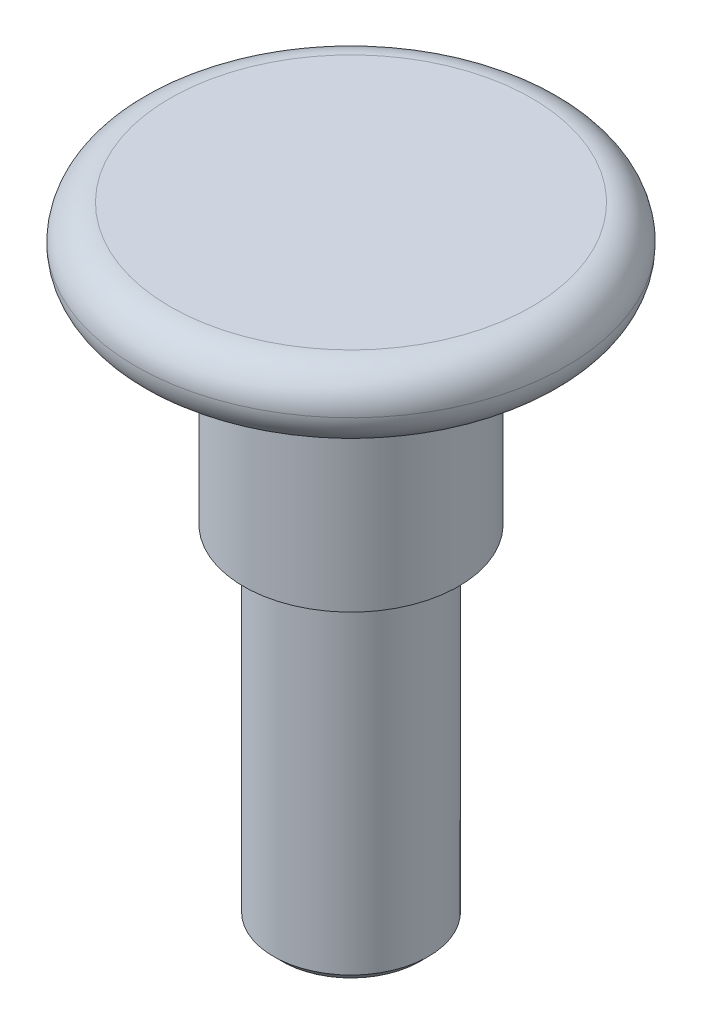
ISO-10303-21;
HEADER;
FILE_DESCRIPTION(('STEP AP214'),'2;1');
FILE_NAME('part.step','',(''),(''),'','','');
FILE_SCHEMA(('AUTOMOTIVE_DESIGN { 1 0 10303 214 1 1 1 1 }'));
ENDSEC;
DATA;
#1=APPLICATION_CONTEXT('core data for automotive mechanical design processes');
#2=APPLICATION_PROTOCOL_DEFINITION('international standard','automotive_design',2000,#1);
#3=PRODUCT_CONTEXT('',#1,'mechanical');
#4=PRODUCT('Part','Part','',(#3));
#5=PRODUCT_RELATED_PRODUCT_CATEGORY('part','',(#4));
#6=PRODUCT_DEFINITION_FORMATION('','',#4);
#7=PRODUCT_DEFINITION_CONTEXT('part definition',#1,'design');
#8=PRODUCT_DEFINITION('design','',#6,#7);
#9=PRODUCT_DEFINITION_SHAPE('','',#8);
#10=(LENGTH_UNIT() NAMED_UNIT(*) SI_UNIT(.MILLI.,.METRE.));
#11=(NAMED_UNIT(*) PLANE_ANGLE_UNIT() SI_UNIT($,.RADIAN.));
#12=(NAMED_UNIT(*) SI_UNIT($,.STERADIAN.) SOLID_ANGLE_UNIT());
#13=UNCERTAINTY_MEASURE_WITH_UNIT(LENGTH_MEASURE(1.E-05),#10,'distance_accuracy_value','');
#14=(GEOMETRIC_REPRESENTATION_CONTEXT(3) GLOBAL_UNCERTAINTY_ASSIGNED_CONTEXT((#13)) GLOBAL_UNIT_ASSIGNED_CONTEXT((#10,
#11,#12)) REPRESENTATION_CONTEXT('',''));
#15=CARTESIAN_POINT('',(0.,0.,0.));
#16=DIRECTION('',(0.,0.,1.));
#17=DIRECTION('',(1.,0.,0.));
#18=AXIS2_PLACEMENT_3D('',#15,#16,#17);
#19=CARTESIAN_POINT('',(0.,63.9570874861572,0.));
#20=DIRECTION('',(0.,1.,0.));
#21=DIRECTION('',(0.,0.,1.));
#22=AXIS2_PLACEMENT_3D('',#19,#20,#21);
#23=PLANE('',#22);
#24=CARTESIAN_POINT('',(0.,63.9570874861572,0.));
#25=DIRECTION('',(0.,1.,0.));
#26=DIRECTION('',(0.,0.,1.));
#27=AXIS2_PLACEMENT_3D('',#24,#25,#26);
#28=CIRCLE('',#27,10.5);
#29=CARTESIAN_POINT('',(0.,63.9570874861572,10.5));
#30=VERTEX_POINT('',#29);
#31=EDGE_CURVE('E42',#30,#30,#28,.T.);
#32=ORIENTED_EDGE('',*,*,#31,.T.);
#33=EDGE_LOOP('',(#32));
#34=FACE_BOUND('',#33,.T.);
#35=ADVANCED_FACE('F31',(#34),#23,.T.);
#36=CARTESIAN_POINT('',(12.5,59.9570874861572,0.));
#37=DIRECTION('',(0.,-1.,0.));
#38=DIRECTION('',(0.,0.,-1.));
#39=AXIS2_PLACEMENT_3D('',#36,#37,#38);
#40=PLANE('',#39);
#41=CARTESIAN_POINT('',(0.,59.9570874861572,0.));
#42=DIRECTION('',(0.,-1.,0.));
#43=DIRECTION('',(0.,0.,-1.));
#44=AXIS2_PLACEMENT_3D('',#41,#42,#43);
#45=CIRCLE('',#44,10.5);
#46=CARTESIAN_POINT('',(0.,59.9570874861572,-10.5));
#47=VERTEX_POINT('',#46);
#48=EDGE_CURVE('E46',#47,#47,#45,.T.);
#49=ORIENTED_EDGE('',*,*,#48,.T.);
#50=EDGE_LOOP('',(#49));
#51=FACE_BOUND('',#50,.T.);
#52=CARTESIAN_POINT('',(0.,59.9570874861572,0.));
#53=DIRECTION('',(0.,-1.,0.));
#54=DIRECTION('',(0.,0.,-1.));
#55=AXIS2_PLACEMENT_3D('',#52,#53,#54);
#56=CIRCLE('',#55,6.25);
#57=CARTESIAN_POINT('',(0.,59.9570874861572,-6.25));
#58=VERTEX_POINT('',#57);
#59=EDGE_CURVE('E55',#58,#58,#56,.T.);
#60=ORIENTED_EDGE('',*,*,#59,.F.);
#61=EDGE_LOOP('',(#60));
#62=FACE_BOUND('',#61,.T.);
#63=ADVANCED_FACE('F77',(#51,#62),#40,.T.);
#64=CARTESIAN_POINT('',(0.,-74.7162236987818,0.));
#65=DIRECTION('',(0.,-1.,0.));
#66=DIRECTION('',(0.,0.,-1.));
#67=AXIS2_PLACEMENT_3D('',#64,#65,#66);
#68=CYLINDRICAL_SURFACE('',#67,6.25);
#69=ORIENTED_EDGE('',*,*,#59,.T.);
#70=EDGE_LOOP('',(#69));
#71=FACE_BOUND('',#70,.T.);
#72=CARTESIAN_POINT('',(0.,47.7570874861572,0.));
#73=DIRECTION('',(0.,-1.,0.));
#74=DIRECTION('',(0.,0.,-1.));
#75=AXIS2_PLACEMENT_3D('',#72,#73,#74);
#76=CIRCLE('',#75,6.25);
#77=CARTESIAN_POINT('',(0.,47.7570874861572,-6.25));
#78=VERTEX_POINT('',#77);
#79=EDGE_CURVE('E58',#78,#78,#76,.T.);
#80=ORIENTED_EDGE('',*,*,#79,.F.);
#81=EDGE_LOOP('',(#80));
#82=FACE_BOUND('',#81,.T.);
#83=ADVANCED_FACE('F68',(#71,#82),#68,.T.);
#84=CARTESIAN_POINT('',(6.25,47.7570874861572,0.));
#85=DIRECTION('',(0.,-1.,0.));
#86=DIRECTION('',(0.,0.,-1.));
#87=AXIS2_PLACEMENT_3D('',#84,#85,#86);
#88=PLANE('',#87);
#89=ORIENTED_EDGE('',*,*,#79,.T.);
#90=EDGE_LOOP('',(#89));
#91=FACE_BOUND('',#90,.T.);
#92=CARTESIAN_POINT('',(0.,47.7570874861572,0.));
#93=DIRECTION('',(0.,-1.,0.));
#94=DIRECTION('',(0.,0.,-1.));
#95=AXIS2_PLACEMENT_3D('',#92,#93,#94);
#96=CIRCLE('',#95,4.49999999999999);
#97=CARTESIAN_POINT('',(0.,47.7570874861572,-4.49999999999999));
#98=VERTEX_POINT('',#97);
#99=EDGE_CURVE('E51',#98,#98,#96,.T.);
#100=ORIENTED_EDGE('',*,*,#99,.F.);
#101=EDGE_LOOP('',(#100));
#102=FACE_BOUND('',#101,.T.);
#103=ADVANCED_FACE('F66',(#91,#102),#88,.T.);
#104=CARTESIAN_POINT('',(0.,-74.7162236987818,0.));
#105=DIRECTION('',(0.,-1.,0.));
#106=DIRECTION('',(0.,0.,-1.));
#107=AXIS2_PLACEMENT_3D('',#104,#105,#106);
#108=CYLINDRICAL_SURFACE('',#107,4.5);
#109=CARTESIAN_POINT('',(0.,28.2570874861572,0.));
#110=DIRECTION('',(0.,-1.,0.));
#111=DIRECTION('',(0.,0.,-1.));
#112=AXIS2_PLACEMENT_3D('',#109,#110,#111);
#113=CIRCLE('',#112,4.5);
#114=CARTESIAN_POINT('',(0.,28.2570874861572,-4.5));
#115=VERTEX_POINT('',#114);
#116=EDGE_CURVE('E10',#115,#115,#113,.F.);
#117=ORIENTED_EDGE('',*,*,#116,.T.);
#118=EDGE_LOOP('',(#117));
#119=FACE_BOUND('',#118,.T.);
#120=ORIENTED_EDGE('',*,*,#99,.T.);
#121=EDGE_LOOP('',(#120));
#122=FACE_BOUND('',#121,.T.);
#123=ADVANCED_FACE('F64',(#119,#122),#108,.T.);
#124=CARTESIAN_POINT('',(4.5,27.7570874861572,0.));
#125=DIRECTION('',(0.,-1.,0.));
#126=DIRECTION('',(0.,0.,-1.));
#127=AXIS2_PLACEMENT_3D('',#124,#125,#126);
#128=PLANE('',#127);
#129=CARTESIAN_POINT('',(0.,27.7570874861572,0.));
#130=DIRECTION('',(0.,-1.,0.));
#131=DIRECTION('',(0.,0.,-1.));
#132=AXIS2_PLACEMENT_3D('',#129,#130,#131);
#133=CIRCLE('',#132,3.99999999999998);
#134=CARTESIAN_POINT('',(0.,27.7570874861572,-3.99999999999998));
#135=VERTEX_POINT('',#134);
#136=EDGE_CURVE('E38',#135,#135,#133,.T.);
#137=ORIENTED_EDGE('',*,*,#136,.T.);
#138=EDGE_LOOP('',(#137));
#139=FACE_BOUND('',#138,.T.);
#140=ADVANCED_FACE('F75',(#139),#128,.T.);
#141=CARTESIAN_POINT('',(0.,61.9570874861572,0.));
#142=DIRECTION('',(0.,1.,0.));
#143=DIRECTION('',(0.,0.,1.));
#144=AXIS2_PLACEMENT_3D('',#141,#142,#143);
#145=TOROIDAL_SURFACE('',#144,10.5,2.);
#146=ORIENTED_EDGE('',*,*,#31,.F.);
#147=EDGE_LOOP('',(#146));
#148=FACE_BOUND('',#147,.T.);
#149=CARTESIAN_POINT('',(0.,61.9570874861572,0.));
#150=DIRECTION('',(0.,1.,0.));
#151=DIRECTION('',(0.,0.,1.));
#152=AXIS2_PLACEMENT_3D('',#149,#150,#151);
#153=CIRCLE('',#152,12.5);
#154=CARTESIAN_POINT('',(0.,61.9570874861572,12.5));
#155=VERTEX_POINT('',#154);
#156=EDGE_CURVE('E49',#155,#155,#153,.F.);
#157=ORIENTED_EDGE('',*,*,#156,.F.);
#158=EDGE_LOOP('',(#157));
#159=FACE_BOUND('',#158,.T.);
#160=ADVANCED_FACE('F91',(#148,#159),#145,.T.);
#161=CARTESIAN_POINT('',(0.,61.9570874861572,0.));
#162=DIRECTION('',(0.,-1.,0.));
#163=DIRECTION('',(0.,0.,-1.));
#164=AXIS2_PLACEMENT_3D('',#161,#162,#163);
#165=TOROIDAL_SURFACE('',#164,10.5,2.);
#166=ORIENTED_EDGE('',*,*,#156,.T.);
#167=EDGE_LOOP('',(#166));
#168=FACE_BOUND('',#167,.T.);
#169=ORIENTED_EDGE('',*,*,#48,.F.);
#170=EDGE_LOOP('',(#169));
#171=FACE_BOUND('',#170,.T.);
#172=ADVANCED_FACE('F89',(#168,#171),#165,.T.);
#173=CARTESIAN_POINT('',(0.,27.7570874861572,0.));
#174=DIRECTION('',(0.,1.,0.));
#175=DIRECTION('',(0.,0.,1.));
#176=AXIS2_PLACEMENT_3D('',#173,#174,#175);
#177=CONICAL_SURFACE('',#176,3.99999999999999,0.785398163397454);
#178=ORIENTED_EDGE('',*,*,#116,.F.);
#179=EDGE_LOOP('',(#178));
#180=FACE_BOUND('',#179,.T.);
#181=ORIENTED_EDGE('',*,*,#136,.F.);
#182=EDGE_LOOP('',(#181));
#183=FACE_BOUND('',#182,.T.);
#184=ADVANCED_FACE('F33',(#180,#183),#177,.T.);
#185=CLOSED_SHELL('',(#35,#63,#83,#103,#123,#140,#160,#172,#184));
#186=MANIFOLD_SOLID_BREP('B2',#185);
#187=ADVANCED_BREP_SHAPE_REPRESENTATION('',(#18,#186),#14);
#188=SHAPE_DEFINITION_REPRESENTATION(#9,#187);
ENDSEC;
END-ISO-10303-21;
